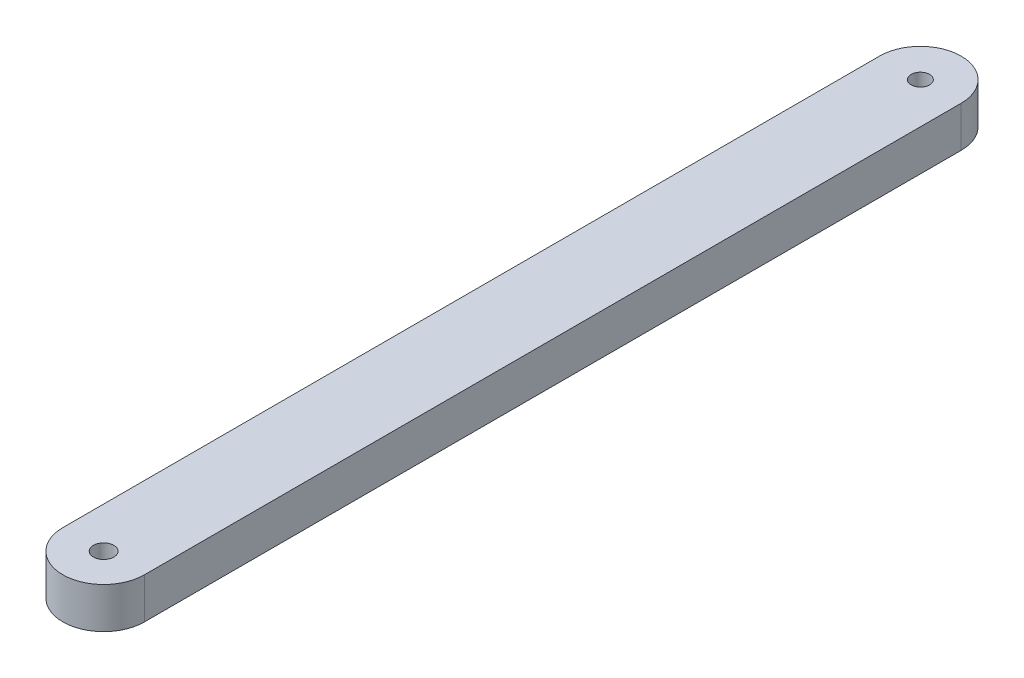
ISO-10303-21;
HEADER;
FILE_DESCRIPTION(('STEP AP214'),'2;1');
FILE_NAME('part.step','',(''),(''),'','','');
FILE_SCHEMA(('AUTOMOTIVE_DESIGN { 1 0 10303 214 1 1 1 1 }'));
ENDSEC;
DATA;
#1=APPLICATION_CONTEXT('core data for automotive mechanical design processes');
#2=APPLICATION_PROTOCOL_DEFINITION('international standard','automotive_design',2000,#1);
#3=PRODUCT_CONTEXT('',#1,'mechanical');
#4=PRODUCT('Part','Part','',(#3));
#5=PRODUCT_RELATED_PRODUCT_CATEGORY('part','',(#4));
#6=PRODUCT_DEFINITION_FORMATION('','',#4);
#7=PRODUCT_DEFINITION_CONTEXT('part definition',#1,'design');
#8=PRODUCT_DEFINITION('design','',#6,#7);
#9=PRODUCT_DEFINITION_SHAPE('','',#8);
#10=(LENGTH_UNIT() NAMED_UNIT(*) SI_UNIT(.MILLI.,.METRE.));
#11=(NAMED_UNIT(*) PLANE_ANGLE_UNIT() SI_UNIT($,.RADIAN.));
#12=(NAMED_UNIT(*) SI_UNIT($,.STERADIAN.) SOLID_ANGLE_UNIT());
#13=UNCERTAINTY_MEASURE_WITH_UNIT(LENGTH_MEASURE(1.E-05),#10,'distance_accuracy_value','');
#14=(GEOMETRIC_REPRESENTATION_CONTEXT(3) GLOBAL_UNCERTAINTY_ASSIGNED_CONTEXT((#13)) GLOBAL_UNIT_ASSIGNED_CONTEXT((#10,
#11,#12)) REPRESENTATION_CONTEXT('',''));
#15=CARTESIAN_POINT('',(0.,0.,0.));
#16=DIRECTION('',(0.,0.,1.));
#17=DIRECTION('',(1.,0.,0.));
#18=AXIS2_PLACEMENT_3D('',#15,#16,#17);
#19=CARTESIAN_POINT('',(0.,10.,100.));
#20=DIRECTION('',(0.,-1.,0.));
#21=DIRECTION('',(0.,0.,-1.));
#22=AXIS2_PLACEMENT_3D('',#19,#20,#21);
#23=CYLINDRICAL_SURFACE('',#22,10.);
#24=CARTESIAN_POINT('',(0.,0.,100.));
#25=DIRECTION('',(0.,1.,0.));
#26=DIRECTION('',(0.,0.,1.));
#27=AXIS2_PLACEMENT_3D('',#24,#25,#26);
#28=CIRCLE('',#27,10.);
#29=CARTESIAN_POINT('',(10.0000000000001,0.,100.));
#30=VERTEX_POINT('',#29);
#31=CARTESIAN_POINT('',(-10.,0.,100.));
#32=VERTEX_POINT('',#31);
#33=EDGE_CURVE('E118',#30,#32,#28,.F.);
#34=ORIENTED_EDGE('',*,*,#33,.F.);
#35=DIRECTION('',(0.,-1.,0.));
#36=VECTOR('',#35,1.);
#37=CARTESIAN_POINT('',(10.0000000000001,10.,100.));
#38=LINE('',#37,#36);
#39=CARTESIAN_POINT('',(10.0000000000001,10.,100.));
#40=VERTEX_POINT('',#39);
#41=EDGE_CURVE('E11',#40,#30,#38,.T.);
#42=ORIENTED_EDGE('',*,*,#41,.F.);
#43=CARTESIAN_POINT('',(0.,10.,100.));
#44=DIRECTION('',(0.,1.,0.));
#45=DIRECTION('',(0.,0.,1.));
#46=AXIS2_PLACEMENT_3D('',#43,#44,#45);
#47=CIRCLE('',#46,10.);
#48=CARTESIAN_POINT('',(-10.,10.,100.));
#49=VERTEX_POINT('',#48);
#50=EDGE_CURVE('E91',#40,#49,#47,.F.);
#51=ORIENTED_EDGE('',*,*,#50,.T.);
#52=DIRECTION('',(0.,-1.,0.));
#53=VECTOR('',#52,1.);
#54=CARTESIAN_POINT('',(-10.,10.,100.));
#55=LINE('',#54,#53);
#56=EDGE_CURVE('E59',#49,#32,#55,.T.);
#57=ORIENTED_EDGE('',*,*,#56,.T.);
#58=EDGE_LOOP('',(#34,#42,#51,#57));
#59=FACE_BOUND('',#58,.T.);
#60=ADVANCED_FACE('F41',(#59),#23,.T.);
#61=CARTESIAN_POINT('',(10.,10.,0.));
#62=DIRECTION('',(-1.,0.,0.));
#63=DIRECTION('',(0.,0.,1.));
#64=AXIS2_PLACEMENT_3D('',#61,#62,#63);
#65=PLANE('',#64);
#66=DIRECTION('',(0.,0.,-1.));
#67=VECTOR('',#66,1.);
#68=CARTESIAN_POINT('',(10.,0.,0.));
#69=LINE('',#68,#67);
#70=CARTESIAN_POINT('',(10.,0.,-99.9999999999997));
#71=VERTEX_POINT('',#70);
#72=EDGE_CURVE('E98',#30,#71,#69,.T.);
#73=ORIENTED_EDGE('',*,*,#72,.T.);
#74=DIRECTION('',(0.,-1.,0.));
#75=VECTOR('',#74,1.);
#76=CARTESIAN_POINT('',(10.,10.,-99.9999999999997));
#77=LINE('',#76,#75);
#78=CARTESIAN_POINT('',(10.,10.,-99.9999999999997));
#79=VERTEX_POINT('',#78);
#80=EDGE_CURVE('E51',#79,#71,#77,.T.);
#81=ORIENTED_EDGE('',*,*,#80,.F.);
#82=DIRECTION('',(0.,0.,-1.));
#83=VECTOR('',#82,1.);
#84=CARTESIAN_POINT('',(10.,10.,0.));
#85=LINE('',#84,#83);
#86=EDGE_CURVE('E85',#40,#79,#85,.T.);
#87=ORIENTED_EDGE('',*,*,#86,.F.);
#88=ORIENTED_EDGE('',*,*,#41,.T.);
#89=EDGE_LOOP('',(#73,#81,#87,#88));
#90=FACE_BOUND('',#89,.T.);
#91=ADVANCED_FACE('F96',(#90),#65,.F.);
#92=CARTESIAN_POINT('',(0.,10.,-99.9999999999997));
#93=DIRECTION('',(0.,-1.,0.));
#94=DIRECTION('',(0.,0.,-1.));
#95=AXIS2_PLACEMENT_3D('',#92,#93,#94);
#96=CYLINDRICAL_SURFACE('',#95,10.);
#97=CARTESIAN_POINT('',(0.,0.,-99.9999999999997));
#98=DIRECTION('',(0.,1.,0.));
#99=DIRECTION('',(0.,0.,1.));
#100=AXIS2_PLACEMENT_3D('',#97,#98,#99);
#101=CIRCLE('',#100,10.);
#102=CARTESIAN_POINT('',(-10.,0.,-99.9999999999997));
#103=VERTEX_POINT('',#102);
#104=EDGE_CURVE('E123',#103,#71,#101,.F.);
#105=ORIENTED_EDGE('',*,*,#104,.F.);
#106=DIRECTION('',(0.,-1.,0.));
#107=VECTOR('',#106,1.);
#108=CARTESIAN_POINT('',(-10.,10.,-99.9999999999997));
#109=LINE('',#108,#107);
#110=CARTESIAN_POINT('',(-10.,10.,-99.9999999999997));
#111=VERTEX_POINT('',#110);
#112=EDGE_CURVE('E72',#111,#103,#109,.T.);
#113=ORIENTED_EDGE('',*,*,#112,.F.);
#114=CARTESIAN_POINT('',(0.,10.,-99.9999999999997));
#115=DIRECTION('',(0.,1.,0.));
#116=DIRECTION('',(0.,0.,1.));
#117=AXIS2_PLACEMENT_3D('',#114,#115,#116);
#118=CIRCLE('',#117,10.);
#119=EDGE_CURVE('E90',#111,#79,#118,.F.);
#120=ORIENTED_EDGE('',*,*,#119,.T.);
#121=ORIENTED_EDGE('',*,*,#80,.T.);
#122=EDGE_LOOP('',(#105,#113,#120,#121));
#123=FACE_BOUND('',#122,.T.);
#124=ADVANCED_FACE('F102',(#123),#96,.T.);
#125=CARTESIAN_POINT('',(0.,10.,100.));
#126=DIRECTION('',(0.,-1.,0.));
#127=DIRECTION('',(0.,0.,-1.));
#128=AXIS2_PLACEMENT_3D('',#125,#126,#127);
#129=CYLINDRICAL_SURFACE('',#128,2.5);
#130=CARTESIAN_POINT('',(0.,10.,100.));
#131=DIRECTION('',(0.,1.,0.));
#132=DIRECTION('',(0.,0.,1.));
#133=AXIS2_PLACEMENT_3D('',#130,#131,#132);
#134=CIRCLE('',#133,2.5);
#135=CARTESIAN_POINT('',(0.,10.,102.5));
#136=VERTEX_POINT('',#135);
#137=EDGE_CURVE('E137',#136,#136,#134,.T.);
#138=ORIENTED_EDGE('',*,*,#137,.T.);
#139=EDGE_LOOP('',(#138));
#140=FACE_BOUND('',#139,.T.);
#141=CARTESIAN_POINT('',(0.,0.,100.));
#142=DIRECTION('',(0.,1.,0.));
#143=DIRECTION('',(0.,0.,1.));
#144=AXIS2_PLACEMENT_3D('',#141,#142,#143);
#145=CIRCLE('',#144,2.5);
#146=CARTESIAN_POINT('',(0.,0.,102.5));
#147=VERTEX_POINT('',#146);
#148=EDGE_CURVE('E114',#147,#147,#145,.T.);
#149=ORIENTED_EDGE('',*,*,#148,.F.);
#150=EDGE_LOOP('',(#149));
#151=FACE_BOUND('',#150,.T.);
#152=ADVANCED_FACE('F155',(#140,#151),#129,.F.);
#153=CARTESIAN_POINT('',(0.,10.,-99.9999999999997));
#154=DIRECTION('',(0.,-1.,0.));
#155=DIRECTION('',(0.,0.,-1.));
#156=AXIS2_PLACEMENT_3D('',#153,#154,#155);
#157=CYLINDRICAL_SURFACE('',#156,2.24506403026728);
#158=CARTESIAN_POINT('',(0.,10.,-99.9999999999997));
#159=DIRECTION('',(0.,1.,0.));
#160=DIRECTION('',(0.,0.,1.));
#161=AXIS2_PLACEMENT_3D('',#158,#159,#160);
#162=CIRCLE('',#161,2.24506403026728);
#163=CARTESIAN_POINT('',(0.,10.,-97.7549359697324));
#164=VERTEX_POINT('',#163);
#165=EDGE_CURVE('E130',#164,#164,#162,.T.);
#166=ORIENTED_EDGE('',*,*,#165,.T.);
#167=EDGE_LOOP('',(#166));
#168=FACE_BOUND('',#167,.T.);
#169=CARTESIAN_POINT('',(0.,0.,-99.9999999999997));
#170=DIRECTION('',(0.,1.,0.));
#171=DIRECTION('',(0.,0.,1.));
#172=AXIS2_PLACEMENT_3D('',#169,#170,#171);
#173=CIRCLE('',#172,2.24506403026728);
#174=CARTESIAN_POINT('',(0.,0.,-97.7549359697324));
#175=VERTEX_POINT('',#174);
#176=EDGE_CURVE('E110',#175,#175,#173,.T.);
#177=ORIENTED_EDGE('',*,*,#176,.F.);
#178=EDGE_LOOP('',(#177));
#179=FACE_BOUND('',#178,.T.);
#180=ADVANCED_FACE('F43',(#168,#179),#157,.F.);
#181=CARTESIAN_POINT('',(-10.,10.,0.));
#182=DIRECTION('',(-1.,0.,0.));
#183=DIRECTION('',(0.,0.,1.));
#184=AXIS2_PLACEMENT_3D('',#181,#182,#183);
#185=PLANE('',#184);
#186=DIRECTION('',(0.,0.,-1.));
#187=VECTOR('',#186,1.);
#188=CARTESIAN_POINT('',(-10.,0.,0.));
#189=LINE('',#188,#187);
#190=EDGE_CURVE('E126',#32,#103,#189,.T.);
#191=ORIENTED_EDGE('',*,*,#190,.F.);
#192=ORIENTED_EDGE('',*,*,#56,.F.);
#193=DIRECTION('',(0.,0.,-1.));
#194=VECTOR('',#193,1.);
#195=CARTESIAN_POINT('',(-10.,10.,0.));
#196=LINE('',#195,#194);
#197=EDGE_CURVE('E104',#49,#111,#196,.T.);
#198=ORIENTED_EDGE('',*,*,#197,.T.);
#199=ORIENTED_EDGE('',*,*,#112,.T.);
#200=EDGE_LOOP('',(#191,#192,#198,#199));
#201=FACE_BOUND('',#200,.T.);
#202=ADVANCED_FACE('F145',(#201),#185,.T.);
#203=CARTESIAN_POINT('',(0.,10.,0.));
#204=DIRECTION('',(0.,1.,0.));
#205=DIRECTION('',(0.,0.,1.));
#206=AXIS2_PLACEMENT_3D('',#203,#204,#205);
#207=PLANE('',#206);
#208=ORIENTED_EDGE('',*,*,#165,.F.);
#209=EDGE_LOOP('',(#208));
#210=FACE_BOUND('',#209,.T.);
#211=ORIENTED_EDGE('',*,*,#137,.F.);
#212=EDGE_LOOP('',(#211));
#213=FACE_BOUND('',#212,.T.);
#214=ORIENTED_EDGE('',*,*,#50,.F.);
#215=ORIENTED_EDGE('',*,*,#86,.T.);
#216=ORIENTED_EDGE('',*,*,#119,.F.);
#217=ORIENTED_EDGE('',*,*,#197,.F.);
#218=EDGE_LOOP('',(#214,#215,#216,#217));
#219=FACE_BOUND('',#218,.T.);
#220=ADVANCED_FACE('F87',(#210,#213,#219),#207,.T.);
#221=CARTESIAN_POINT('',(0.,0.,0.));
#222=DIRECTION('',(0.,1.,0.));
#223=DIRECTION('',(0.,0.,1.));
#224=AXIS2_PLACEMENT_3D('',#221,#222,#223);
#225=PLANE('',#224);
#226=ORIENTED_EDGE('',*,*,#176,.T.);
#227=EDGE_LOOP('',(#226));
#228=FACE_BOUND('',#227,.T.);
#229=ORIENTED_EDGE('',*,*,#148,.T.);
#230=EDGE_LOOP('',(#229));
#231=FACE_BOUND('',#230,.T.);
#232=ORIENTED_EDGE('',*,*,#33,.T.);
#233=ORIENTED_EDGE('',*,*,#190,.T.);
#234=ORIENTED_EDGE('',*,*,#104,.T.);
#235=ORIENTED_EDGE('',*,*,#72,.F.);
#236=EDGE_LOOP('',(#232,#233,#234,#235));
#237=FACE_BOUND('',#236,.T.);
#238=ADVANCED_FACE('F152',(#228,#231,#237),#225,.F.);
#239=CLOSED_SHELL('',(#60,#91,#124,#152,#180,#202,#220,#238));
#240=MANIFOLD_SOLID_BREP('B2',#239);
#241=ADVANCED_BREP_SHAPE_REPRESENTATION('',(#18,#240),#14);
#242=SHAPE_DEFINITION_REPRESENTATION(#9,#241);
ENDSEC;
END-ISO-10303-21;
